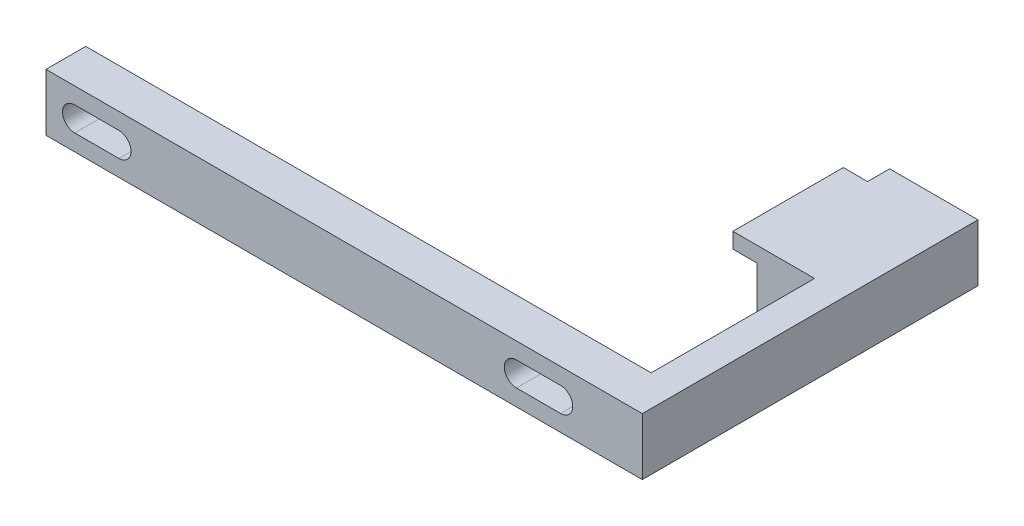
ISO-10303-21;
HEADER;
FILE_DESCRIPTION(('STEP AP214'),'2;1');
FILE_NAME('part.step','',(''),(''),'','','');
FILE_SCHEMA(('AUTOMOTIVE_DESIGN { 1 0 10303 214 1 1 1 1 }'));
ENDSEC;
DATA;
#1=APPLICATION_CONTEXT('core data for automotive mechanical design processes');
#2=APPLICATION_PROTOCOL_DEFINITION('international standard','automotive_design',2000,#1);
#3=PRODUCT_CONTEXT('',#1,'mechanical');
#4=PRODUCT('Part','Part','',(#3));
#5=PRODUCT_RELATED_PRODUCT_CATEGORY('part','',(#4));
#6=PRODUCT_DEFINITION_FORMATION('','',#4);
#7=PRODUCT_DEFINITION_CONTEXT('part definition',#1,'design');
#8=PRODUCT_DEFINITION('design','',#6,#7);
#9=PRODUCT_DEFINITION_SHAPE('','',#8);
#10=(LENGTH_UNIT() NAMED_UNIT(*) SI_UNIT(.MILLI.,.METRE.));
#11=(NAMED_UNIT(*) PLANE_ANGLE_UNIT() SI_UNIT($,.RADIAN.));
#12=(NAMED_UNIT(*) SI_UNIT($,.STERADIAN.) SOLID_ANGLE_UNIT());
#13=UNCERTAINTY_MEASURE_WITH_UNIT(LENGTH_MEASURE(1.E-05),#10,'distance_accuracy_value','');
#14=(GEOMETRIC_REPRESENTATION_CONTEXT(3) GLOBAL_UNCERTAINTY_ASSIGNED_CONTEXT((#13)) GLOBAL_UNIT_ASSIGNED_CONTEXT((#10,
#11,#12)) REPRESENTATION_CONTEXT('',''));
#15=CARTESIAN_POINT('',(0.,0.,0.));
#16=DIRECTION('',(0.,0.,1.));
#17=DIRECTION('',(1.,0.,0.));
#18=AXIS2_PLACEMENT_3D('',#15,#16,#17);
#19=CARTESIAN_POINT('',(107.5,0.,0.));
#20=DIRECTION('',(1.,0.,0.));
#21=DIRECTION('',(0.,0.,-1.));
#22=AXIS2_PLACEMENT_3D('',#19,#20,#21);
#23=PLANE('',#22);
#24=CARTESIAN_POINT('',(107.5,-3.71881314497985,-58.8));
#25=DIRECTION('',(-1.,0.,0.));
#26=DIRECTION('',(0.,0.,1.));
#27=AXIS2_PLACEMENT_3D('',#24,#25,#26);
#28=CIRCLE('',#27,1.5);
#29=CARTESIAN_POINT('',(107.5,-3.71881314497985,-57.3));
#30=VERTEX_POINT('',#29);
#31=EDGE_CURVE('E280',#30,#30,#28,.T.);
#32=ORIENTED_EDGE('',*,*,#31,.F.);
#33=EDGE_LOOP('',(#32));
#34=FACE_BOUND('',#33,.T.);
#35=CARTESIAN_POINT('',(107.5,-3.71881314497985,-39.75));
#36=DIRECTION('',(-1.,0.,0.));
#37=DIRECTION('',(0.,0.,1.));
#38=AXIS2_PLACEMENT_3D('',#35,#36,#37);
#39=CIRCLE('',#38,1.5);
#40=CARTESIAN_POINT('',(107.5,-3.71881314497985,-38.25));
#41=VERTEX_POINT('',#40);
#42=EDGE_CURVE('E277',#41,#41,#39,.T.);
#43=ORIENTED_EDGE('',*,*,#42,.F.);
#44=EDGE_LOOP('',(#43));
#45=FACE_BOUND('',#44,.T.);
#46=DIRECTION('',(0.,-1.,0.));
#47=VECTOR('',#46,1.);
#48=CARTESIAN_POINT('',(107.5,6.46881314497985,-62.));
#49=LINE('',#48,#47);
#50=CARTESIAN_POINT('',(107.5,6.46881314497985,-62.));
#51=VERTEX_POINT('',#50);
#52=CARTESIAN_POINT('',(107.5,2.96881314497985,-62.));
#53=VERTEX_POINT('',#52);
#54=EDGE_CURVE('E217',#51,#53,#49,.T.);
#55=ORIENTED_EDGE('',*,*,#54,.F.);
#56=DIRECTION('',(0.,0.,1.));
#57=VECTOR('',#56,1.);
#58=CARTESIAN_POINT('',(107.5,6.46881314497985,-54.));
#59=LINE('',#58,#57);
#60=CARTESIAN_POINT('',(107.5,6.46881314497985,-67.));
#61=VERTEX_POINT('',#60);
#62=EDGE_CURVE('E305',#61,#51,#59,.T.);
#63=ORIENTED_EDGE('',*,*,#62,.F.);
#64=DIRECTION('',(0.,-1.,0.));
#65=VECTOR('',#64,1.);
#66=CARTESIAN_POINT('',(107.5,-6.46881314497985,-67.));
#67=LINE('',#66,#65);
#68=CARTESIAN_POINT('',(107.5,-6.46881314497985,-67.));
#69=VERTEX_POINT('',#68);
#70=EDGE_CURVE('E276',#61,#69,#67,.T.);
#71=ORIENTED_EDGE('',*,*,#70,.T.);
#72=DIRECTION('',(0.,0.,-1.));
#73=VECTOR('',#72,1.);
#74=CARTESIAN_POINT('',(107.5,-6.46881314497985,-54.));
#75=LINE('',#74,#73);
#76=CARTESIAN_POINT('',(107.5,-6.46881314497985,-37.));
#77=VERTEX_POINT('',#76);
#78=EDGE_CURVE('E306',#77,#69,#75,.T.);
#79=ORIENTED_EDGE('',*,*,#78,.F.);
#80=DIRECTION('',(0.,1.,0.));
#81=VECTOR('',#80,1.);
#82=CARTESIAN_POINT('',(107.5,6.46881314497985,-37.));
#83=LINE('',#82,#81);
#84=CARTESIAN_POINT('',(107.5,2.96881314497985,-37.));
#85=VERTEX_POINT('',#84);
#86=EDGE_CURVE('E287',#77,#85,#83,.T.);
#87=ORIENTED_EDGE('',*,*,#86,.T.);
#88=DIRECTION('',(0.,0.,1.));
#89=VECTOR('',#88,1.);
#90=CARTESIAN_POINT('',(107.5,2.96881314497985,-62.));
#91=LINE('',#90,#89);
#92=EDGE_CURVE('E252',#53,#85,#91,.T.);
#93=ORIENTED_EDGE('',*,*,#92,.F.);
#94=EDGE_LOOP('',(#55,#63,#71,#79,#87,#93));
#95=FACE_BOUND('',#94,.T.);
#96=ADVANCED_FACE('F46',(#34,#45,#95),#23,.F.);
#97=CARTESIAN_POINT('',(120.5,6.46881314497985,-131.709934534819));
#98=DIRECTION('',(1.,0.,0.));
#99=DIRECTION('',(0.,0.,-1.));
#100=AXIS2_PLACEMENT_3D('',#97,#98,#99);
#101=PLANE('',#100);
#102=DIRECTION('',(0.,0.,1.));
#103=VECTOR('',#102,1.);
#104=CARTESIAN_POINT('',(120.5,6.46881314497985,-131.709934534819));
#105=LINE('',#104,#103);
#106=CARTESIAN_POINT('',(120.5,6.46881314497985,-37.));
#107=VERTEX_POINT('',#106);
#108=CARTESIAN_POINT('',(120.5,6.46881314497985,0.));
#109=VERTEX_POINT('',#108);
#110=EDGE_CURVE('E314',#107,#109,#105,.T.);
#111=ORIENTED_EDGE('',*,*,#110,.F.);
#112=DIRECTION('',(0.,-1.,0.));
#113=VECTOR('',#112,1.);
#114=CARTESIAN_POINT('',(120.5,6.46881314497985,-37.));
#115=LINE('',#114,#113);
#116=CARTESIAN_POINT('',(120.5,-6.46881314497985,-37.));
#117=VERTEX_POINT('',#116);
#118=EDGE_CURVE('E303',#107,#117,#115,.T.);
#119=ORIENTED_EDGE('',*,*,#118,.T.);
#120=DIRECTION('',(0.,0.,1.));
#121=VECTOR('',#120,1.);
#122=CARTESIAN_POINT('',(120.5,-6.46881314497985,-131.709934534819));
#123=LINE('',#122,#121);
#124=CARTESIAN_POINT('',(120.5,-6.46881314497985,0.));
#125=VERTEX_POINT('',#124);
#126=EDGE_CURVE('E308',#117,#125,#123,.T.);
#127=ORIENTED_EDGE('',*,*,#126,.T.);
#128=DIRECTION('',(0.,1.,0.));
#129=VECTOR('',#128,1.);
#130=CARTESIAN_POINT('',(120.5,6.46881314497985,0.));
#131=LINE('',#130,#129);
#132=EDGE_CURVE('E311',#125,#109,#131,.T.);
#133=ORIENTED_EDGE('',*,*,#132,.T.);
#134=EDGE_LOOP('',(#111,#119,#127,#133));
#135=FACE_BOUND('',#134,.T.);
#136=ADVANCED_FACE('F368',(#135),#101,.F.);
#137=CARTESIAN_POINT('',(-7.5,-6.46881314497985,9.));
#138=DIRECTION('',(1.,0.,0.));
#139=DIRECTION('',(0.,0.,-1.));
#140=AXIS2_PLACEMENT_3D('',#137,#138,#139);
#141=PLANE('',#140);
#142=DIRECTION('',(0.,-1.,0.));
#143=VECTOR('',#142,1.);
#144=CARTESIAN_POINT('',(-7.5,-6.46881314497985,0.));
#145=LINE('',#144,#143);
#146=CARTESIAN_POINT('',(-7.5,6.46881314497985,0.));
#147=VERTEX_POINT('',#146);
#148=CARTESIAN_POINT('',(-7.5,-6.46881314497985,0.));
#149=VERTEX_POINT('',#148);
#150=EDGE_CURVE('E317',#147,#149,#145,.T.);
#151=ORIENTED_EDGE('',*,*,#150,.T.);
#152=DIRECTION('',(0.,0.,-1.));
#153=VECTOR('',#152,1.);
#154=CARTESIAN_POINT('',(-7.5,-6.46881314497985,9.));
#155=LINE('',#154,#153);
#156=CARTESIAN_POINT('',(-7.5,-6.46881314497985,9.));
#157=VERTEX_POINT('',#156);
#158=EDGE_CURVE('E13',#157,#149,#155,.T.);
#159=ORIENTED_EDGE('',*,*,#158,.F.);
#160=DIRECTION('',(0.,-1.,0.));
#161=VECTOR('',#160,1.);
#162=CARTESIAN_POINT('',(-7.5,-6.46881314497985,9.));
#163=LINE('',#162,#161);
#164=CARTESIAN_POINT('',(-7.5,6.46881314497985,9.));
#165=VERTEX_POINT('',#164);
#166=EDGE_CURVE('E318',#165,#157,#163,.T.);
#167=ORIENTED_EDGE('',*,*,#166,.F.);
#168=DIRECTION('',(0.,0.,-1.));
#169=VECTOR('',#168,1.);
#170=CARTESIAN_POINT('',(-7.5,6.46881314497985,9.));
#171=LINE('',#170,#169);
#172=EDGE_CURVE('E328',#165,#147,#171,.T.);
#173=ORIENTED_EDGE('',*,*,#172,.T.);
#174=EDGE_LOOP('',(#151,#159,#167,#173));
#175=FACE_BOUND('',#174,.T.);
#176=ADVANCED_FACE('F48',(#175),#141,.F.);
#177=CARTESIAN_POINT('',(-7.5,-6.46881314497985,9.));
#178=DIRECTION('',(0.,1.,0.));
#179=DIRECTION('',(0.,0.,1.));
#180=AXIS2_PLACEMENT_3D('',#177,#178,#179);
#181=PLANE('',#180);
#182=ORIENTED_EDGE('',*,*,#126,.F.);
#183=DIRECTION('',(-1.,0.,0.));
#184=VECTOR('',#183,1.);
#185=CARTESIAN_POINT('',(160.170815325282,-6.46881314497985,-37.));
#186=LINE('',#185,#184);
#187=EDGE_CURVE('E293',#117,#77,#186,.T.);
#188=ORIENTED_EDGE('',*,*,#187,.T.);
#189=ORIENTED_EDGE('',*,*,#78,.T.);
#190=DIRECTION('',(-1.,0.,0.));
#191=VECTOR('',#190,1.);
#192=CARTESIAN_POINT('',(160.170815325282,-6.46881314497985,-67.));
#193=LINE('',#192,#191);
#194=CARTESIAN_POINT('',(127.5,-6.46881314497985,-67.));
#195=VERTEX_POINT('',#194);
#196=EDGE_CURVE('E296',#195,#69,#193,.T.);
#197=ORIENTED_EDGE('',*,*,#196,.F.);
#198=DIRECTION('',(0.,0.,-1.));
#199=VECTOR('',#198,1.);
#200=CARTESIAN_POINT('',(127.5,-6.46881314497985,9.));
#201=LINE('',#200,#199);
#202=CARTESIAN_POINT('',(127.5,-6.46881314497985,9.));
#203=VERTEX_POINT('',#202);
#204=EDGE_CURVE('E54',#203,#195,#201,.T.);
#205=ORIENTED_EDGE('',*,*,#204,.F.);
#206=DIRECTION('',(1.,0.,0.));
#207=VECTOR('',#206,1.);
#208=CARTESIAN_POINT('',(-7.5,-6.46881314497985,9.));
#209=LINE('',#208,#207);
#210=EDGE_CURVE('E321',#157,#203,#209,.T.);
#211=ORIENTED_EDGE('',*,*,#210,.F.);
#212=ORIENTED_EDGE('',*,*,#158,.T.);
#213=DIRECTION('',(1.,0.,0.));
#214=VECTOR('',#213,1.);
#215=CARTESIAN_POINT('',(-7.5,-6.46881314497985,0.));
#216=LINE('',#215,#214);
#217=EDGE_CURVE('E331',#149,#125,#216,.T.);
#218=ORIENTED_EDGE('',*,*,#217,.T.);
#219=EDGE_LOOP('',(#182,#188,#189,#197,#205,#211,#212,#218));
#220=FACE_BOUND('',#219,.T.);
#221=ADVANCED_FACE('F348',(#220),#181,.F.);
#222=CARTESIAN_POINT('',(127.5,-6.46881314497985,9.));
#223=DIRECTION('',(-1.,0.,0.));
#224=DIRECTION('',(0.,0.,1.));
#225=AXIS2_PLACEMENT_3D('',#222,#223,#224);
#226=PLANE('',#225);
#227=ORIENTED_EDGE('',*,*,#204,.T.);
#228=DIRECTION('',(0.,1.,0.));
#229=VECTOR('',#228,1.);
#230=CARTESIAN_POINT('',(127.5,-6.46881314497985,-67.));
#231=LINE('',#230,#229);
#232=CARTESIAN_POINT('',(127.5,6.46881314497985,-67.));
#233=VERTEX_POINT('',#232);
#234=EDGE_CURVE('E292',#195,#233,#231,.T.);
#235=ORIENTED_EDGE('',*,*,#234,.T.);
#236=DIRECTION('',(0.,0.,-1.));
#237=VECTOR('',#236,1.);
#238=CARTESIAN_POINT('',(127.5,6.46881314497985,9.));
#239=LINE('',#238,#237);
#240=CARTESIAN_POINT('',(127.5,6.46881314497985,9.));
#241=VERTEX_POINT('',#240);
#242=EDGE_CURVE('E337',#241,#233,#239,.T.);
#243=ORIENTED_EDGE('',*,*,#242,.F.);
#244=DIRECTION('',(0.,1.,0.));
#245=VECTOR('',#244,1.);
#246=CARTESIAN_POINT('',(127.5,-6.46881314497985,9.));
#247=LINE('',#246,#245);
#248=EDGE_CURVE('E324',#203,#241,#247,.T.);
#249=ORIENTED_EDGE('',*,*,#248,.F.);
#250=EDGE_LOOP('',(#227,#235,#243,#249));
#251=FACE_BOUND('',#250,.T.);
#252=ADVANCED_FACE('F342',(#251),#226,.F.);
#253=CARTESIAN_POINT('',(-7.5,6.46881314497985,9.));
#254=DIRECTION('',(0.,-1.,0.));
#255=DIRECTION('',(0.,0.,-1.));
#256=AXIS2_PLACEMENT_3D('',#253,#254,#255);
#257=PLANE('',#256);
#258=DIRECTION('',(-1.,0.,0.));
#259=VECTOR('',#258,1.);
#260=CARTESIAN_POINT('',(160.170815325282,6.46881314497985,-37.));
#261=LINE('',#260,#259);
#262=CARTESIAN_POINT('',(102.,6.46881314497985,-37.));
#263=VERTEX_POINT('',#262);
#264=EDGE_CURVE('E290',#107,#263,#261,.T.);
#265=ORIENTED_EDGE('',*,*,#264,.F.);
#266=ORIENTED_EDGE('',*,*,#110,.T.);
#267=DIRECTION('',(-1.,0.,0.));
#268=VECTOR('',#267,1.);
#269=CARTESIAN_POINT('',(-7.5,6.46881314497985,0.));
#270=LINE('',#269,#268);
#271=EDGE_CURVE('E322',#109,#147,#270,.T.);
#272=ORIENTED_EDGE('',*,*,#271,.T.);
#273=ORIENTED_EDGE('',*,*,#172,.F.);
#274=DIRECTION('',(-1.,0.,0.));
#275=VECTOR('',#274,1.);
#276=CARTESIAN_POINT('',(-7.5,6.46881314497985,9.));
#277=LINE('',#276,#275);
#278=EDGE_CURVE('E326',#241,#165,#277,.T.);
#279=ORIENTED_EDGE('',*,*,#278,.F.);
#280=ORIENTED_EDGE('',*,*,#242,.T.);
#281=DIRECTION('',(-1.,0.,0.));
#282=VECTOR('',#281,1.);
#283=CARTESIAN_POINT('',(160.170815325282,6.46881314497985,-67.));
#284=LINE('',#283,#282);
#285=EDGE_CURVE('E289',#233,#61,#284,.T.);
#286=ORIENTED_EDGE('',*,*,#285,.T.);
#287=ORIENTED_EDGE('',*,*,#62,.T.);
#288=DIRECTION('',(1.,0.,0.));
#289=VECTOR('',#288,1.);
#290=CARTESIAN_POINT('',(102.,6.46881314497985,-62.));
#291=LINE('',#290,#289);
#292=CARTESIAN_POINT('',(102.,6.46881314497985,-62.));
#293=VERTEX_POINT('',#292);
#294=EDGE_CURVE('E259',#293,#51,#291,.T.);
#295=ORIENTED_EDGE('',*,*,#294,.F.);
#296=DIRECTION('',(0.,0.,-1.));
#297=VECTOR('',#296,1.);
#298=CARTESIAN_POINT('',(102.,6.46881314497985,-62.));
#299=LINE('',#298,#297);
#300=EDGE_CURVE('E257',#263,#293,#299,.T.);
#301=ORIENTED_EDGE('',*,*,#300,.F.);
#302=EDGE_LOOP('',(#265,#266,#272,#273,#279,#280,#286,#287,#295,#301));
#303=FACE_BOUND('',#302,.T.);
#304=ADVANCED_FACE('F354',(#303),#257,.F.);
#305=CARTESIAN_POINT('',(0.,0.,9.));
#306=DIRECTION('',(0.,0.,-1.));
#307=DIRECTION('',(-1.,0.,0.));
#308=AXIS2_PLACEMENT_3D('',#305,#306,#307);
#309=PLANE('',#308);
#310=CARTESIAN_POINT('',(9.,0.,9.));
#311=DIRECTION('',(0.,0.,1.));
#312=DIRECTION('',(1.,0.,0.));
#313=AXIS2_PLACEMENT_3D('',#310,#311,#312);
#314=CIRCLE('',#313,2.75);
#315=CARTESIAN_POINT('',(9.,-2.75,9.));
#316=VERTEX_POINT('',#315);
#317=CARTESIAN_POINT('',(9.,2.75,9.));
#318=VERTEX_POINT('',#317);
#319=EDGE_CURVE('E203',#316,#318,#314,.T.);
#320=ORIENTED_EDGE('',*,*,#319,.F.);
#321=DIRECTION('',(1.,0.,0.));
#322=VECTOR('',#321,1.);
#323=CARTESIAN_POINT('',(-1.,-2.75,9.));
#324=LINE('',#323,#322);
#325=CARTESIAN_POINT('',(-1.,-2.75,9.));
#326=VERTEX_POINT('',#325);
#327=EDGE_CURVE('E196',#326,#316,#324,.T.);
#328=ORIENTED_EDGE('',*,*,#327,.F.);
#329=CARTESIAN_POINT('',(-1.,0.,9.));
#330=DIRECTION('',(0.,0.,1.));
#331=DIRECTION('',(1.,0.,0.));
#332=AXIS2_PLACEMENT_3D('',#329,#330,#331);
#333=CIRCLE('',#332,2.75);
#334=CARTESIAN_POINT('',(-1.,2.75,9.));
#335=VERTEX_POINT('',#334);
#336=EDGE_CURVE('E207',#335,#326,#333,.T.);
#337=ORIENTED_EDGE('',*,*,#336,.F.);
#338=DIRECTION('',(-1.,0.,0.));
#339=VECTOR('',#338,1.);
#340=CARTESIAN_POINT('',(-1.,2.75,9.));
#341=LINE('',#340,#339);
#342=EDGE_CURVE('E61',#318,#335,#341,.T.);
#343=ORIENTED_EDGE('',*,*,#342,.F.);
#344=EDGE_LOOP('',(#320,#328,#337,#343));
#345=FACE_BOUND('',#344,.T.);
#346=CARTESIAN_POINT('',(99.,0.,9.));
#347=DIRECTION('',(0.,0.,1.));
#348=DIRECTION('',(1.,0.,0.));
#349=AXIS2_PLACEMENT_3D('',#346,#347,#348);
#350=CIRCLE('',#349,2.75);
#351=CARTESIAN_POINT('',(99.,2.75000000000001,9.));
#352=VERTEX_POINT('',#351);
#353=CARTESIAN_POINT('',(99.,-2.75,9.));
#354=VERTEX_POINT('',#353);
#355=EDGE_CURVE('E244',#352,#354,#350,.T.);
#356=ORIENTED_EDGE('',*,*,#355,.F.);
#357=DIRECTION('',(-1.,0.,0.));
#358=VECTOR('',#357,1.);
#359=CARTESIAN_POINT('',(109.,2.75,9.));
#360=LINE('',#359,#358);
#361=CARTESIAN_POINT('',(109.,2.75,9.));
#362=VERTEX_POINT('',#361);
#363=EDGE_CURVE('E241',#362,#352,#360,.T.);
#364=ORIENTED_EDGE('',*,*,#363,.F.);
#365=CARTESIAN_POINT('',(109.,0.,9.));
#366=DIRECTION('',(0.,0.,1.));
#367=DIRECTION('',(1.,0.,0.));
#368=AXIS2_PLACEMENT_3D('',#365,#366,#367);
#369=CIRCLE('',#368,2.75);
#370=CARTESIAN_POINT('',(109.,-2.74999999999999,9.));
#371=VERTEX_POINT('',#370);
#372=EDGE_CURVE('E238',#371,#362,#369,.T.);
#373=ORIENTED_EDGE('',*,*,#372,.F.);
#374=DIRECTION('',(1.,0.,0.));
#375=VECTOR('',#374,1.);
#376=CARTESIAN_POINT('',(109.,-2.75,9.));
#377=LINE('',#376,#375);
#378=EDGE_CURVE('E69',#354,#371,#377,.T.);
#379=ORIENTED_EDGE('',*,*,#378,.F.);
#380=EDGE_LOOP('',(#356,#364,#373,#379));
#381=FACE_BOUND('',#380,.T.);
#382=ORIENTED_EDGE('',*,*,#166,.T.);
#383=ORIENTED_EDGE('',*,*,#210,.T.);
#384=ORIENTED_EDGE('',*,*,#248,.T.);
#385=ORIENTED_EDGE('',*,*,#278,.T.);
#386=EDGE_LOOP('',(#382,#383,#384,#385));
#387=FACE_BOUND('',#386,.T.);
#388=ADVANCED_FACE('F360',(#345,#381,#387),#309,.F.);
#389=CARTESIAN_POINT('',(0.,0.,0.));
#390=DIRECTION('',(0.,0.,-1.));
#391=DIRECTION('',(-1.,0.,0.));
#392=AXIS2_PLACEMENT_3D('',#389,#390,#391);
#393=PLANE('',#392);
#394=DIRECTION('',(1.,0.,0.));
#395=VECTOR('',#394,1.);
#396=CARTESIAN_POINT('',(-1.,-2.75,0.));
#397=LINE('',#396,#395);
#398=CARTESIAN_POINT('',(-1.,-2.75,0.));
#399=VERTEX_POINT('',#398);
#400=CARTESIAN_POINT('',(9.,-2.75,0.));
#401=VERTEX_POINT('',#400);
#402=EDGE_CURVE('E193',#399,#401,#397,.T.);
#403=ORIENTED_EDGE('',*,*,#402,.T.);
#404=CARTESIAN_POINT('',(9.,0.,0.));
#405=DIRECTION('',(0.,0.,-1.));
#406=DIRECTION('',(-1.,0.,0.));
#407=AXIS2_PLACEMENT_3D('',#404,#405,#406);
#408=CIRCLE('',#407,2.75);
#409=CARTESIAN_POINT('',(9.,2.75,0.));
#410=VERTEX_POINT('',#409);
#411=EDGE_CURVE('E179',#401,#410,#408,.F.);
#412=ORIENTED_EDGE('',*,*,#411,.T.);
#413=DIRECTION('',(-1.,0.,0.));
#414=VECTOR('',#413,1.);
#415=CARTESIAN_POINT('',(-1.,2.75,0.));
#416=LINE('',#415,#414);
#417=CARTESIAN_POINT('',(-1.,2.75,0.));
#418=VERTEX_POINT('',#417);
#419=EDGE_CURVE('E212',#410,#418,#416,.T.);
#420=ORIENTED_EDGE('',*,*,#419,.T.);
#421=CARTESIAN_POINT('',(-1.,0.,0.));
#422=DIRECTION('',(0.,0.,-1.));
#423=DIRECTION('',(-1.,0.,0.));
#424=AXIS2_PLACEMENT_3D('',#421,#422,#423);
#425=CIRCLE('',#424,2.75);
#426=EDGE_CURVE('E201',#418,#399,#425,.F.);
#427=ORIENTED_EDGE('',*,*,#426,.T.);
#428=EDGE_LOOP('',(#403,#412,#420,#427));
#429=FACE_BOUND('',#428,.T.);
#430=DIRECTION('',(-1.,0.,0.));
#431=VECTOR('',#430,1.);
#432=CARTESIAN_POINT('',(109.,2.75,0.));
#433=LINE('',#432,#431);
#434=CARTESIAN_POINT('',(109.,2.75000000000001,0.));
#435=VERTEX_POINT('',#434);
#436=CARTESIAN_POINT('',(99.,2.75000000000001,0.));
#437=VERTEX_POINT('',#436);
#438=EDGE_CURVE('E223',#435,#437,#433,.T.);
#439=ORIENTED_EDGE('',*,*,#438,.T.);
#440=CARTESIAN_POINT('',(99.,0.,0.));
#441=DIRECTION('',(0.,0.,-1.));
#442=DIRECTION('',(-1.,0.,0.));
#443=AXIS2_PLACEMENT_3D('',#440,#441,#442);
#444=CIRCLE('',#443,2.75);
#445=CARTESIAN_POINT('',(99.,-2.74999999999999,0.));
#446=VERTEX_POINT('',#445);
#447=EDGE_CURVE('E224',#437,#446,#444,.F.);
#448=ORIENTED_EDGE('',*,*,#447,.T.);
#449=DIRECTION('',(1.,0.,0.));
#450=VECTOR('',#449,1.);
#451=CARTESIAN_POINT('',(109.,-2.75,0.));
#452=LINE('',#451,#450);
#453=CARTESIAN_POINT('',(109.,-2.75,0.));
#454=VERTEX_POINT('',#453);
#455=EDGE_CURVE('E227',#446,#454,#452,.T.);
#456=ORIENTED_EDGE('',*,*,#455,.T.);
#457=CARTESIAN_POINT('',(109.,0.,0.));
#458=DIRECTION('',(0.,0.,-1.));
#459=DIRECTION('',(-1.,0.,0.));
#460=AXIS2_PLACEMENT_3D('',#457,#458,#459);
#461=CIRCLE('',#460,2.75);
#462=EDGE_CURVE('E220',#454,#435,#461,.F.);
#463=ORIENTED_EDGE('',*,*,#462,.T.);
#464=EDGE_LOOP('',(#439,#448,#456,#463));
#465=FACE_BOUND('',#464,.T.);
#466=ORIENTED_EDGE('',*,*,#132,.F.);
#467=ORIENTED_EDGE('',*,*,#217,.F.);
#468=ORIENTED_EDGE('',*,*,#150,.F.);
#469=ORIENTED_EDGE('',*,*,#271,.F.);
#470=EDGE_LOOP('',(#466,#467,#468,#469));
#471=FACE_BOUND('',#470,.T.);
#472=ADVANCED_FACE('F199',(#429,#465,#471),#393,.T.);
#473=CARTESIAN_POINT('',(160.170815325282,6.46881314497985,-37.));
#474=DIRECTION('',(0.,0.,1.));
#475=DIRECTION('',(1.,0.,0.));
#476=AXIS2_PLACEMENT_3D('',#473,#474,#475);
#477=PLANE('',#476);
#478=ORIENTED_EDGE('',*,*,#118,.F.);
#479=ORIENTED_EDGE('',*,*,#264,.T.);
#480=DIRECTION('',(0.,1.,0.));
#481=VECTOR('',#480,1.);
#482=CARTESIAN_POINT('',(102.,6.46881314497985,-37.));
#483=LINE('',#482,#481);
#484=CARTESIAN_POINT('',(102.,2.96881314497985,-37.));
#485=VERTEX_POINT('',#484);
#486=EDGE_CURVE('E254',#485,#263,#483,.T.);
#487=ORIENTED_EDGE('',*,*,#486,.F.);
#488=DIRECTION('',(1.,0.,0.));
#489=VECTOR('',#488,1.);
#490=CARTESIAN_POINT('',(102.,2.96881314497985,-37.));
#491=LINE('',#490,#489);
#492=EDGE_CURVE('E266',#485,#85,#491,.T.);
#493=ORIENTED_EDGE('',*,*,#492,.T.);
#494=ORIENTED_EDGE('',*,*,#86,.F.);
#495=ORIENTED_EDGE('',*,*,#187,.F.);
#496=EDGE_LOOP('',(#478,#479,#487,#493,#494,#495));
#497=FACE_BOUND('',#496,.T.);
#498=ADVANCED_FACE('F373',(#497),#477,.T.);
#499=CARTESIAN_POINT('',(160.170815325282,-6.46881314497985,-67.));
#500=DIRECTION('',(0.,0.,-1.));
#501=DIRECTION('',(-1.,0.,0.));
#502=AXIS2_PLACEMENT_3D('',#499,#500,#501);
#503=PLANE('',#502);
#504=ORIENTED_EDGE('',*,*,#234,.F.);
#505=ORIENTED_EDGE('',*,*,#196,.T.);
#506=ORIENTED_EDGE('',*,*,#70,.F.);
#507=ORIENTED_EDGE('',*,*,#285,.F.);
#508=EDGE_LOOP('',(#504,#505,#506,#507));
#509=FACE_BOUND('',#508,.T.);
#510=ADVANCED_FACE('F351',(#509),#503,.T.);
#511=CARTESIAN_POINT('',(112.5,-3.71881314497985,-58.8));
#512=DIRECTION('',(-1.,0.,0.));
#513=DIRECTION('',(0.,0.,1.));
#514=AXIS2_PLACEMENT_3D('',#511,#512,#513);
#515=CYLINDRICAL_SURFACE('',#514,1.5);
#516=CARTESIAN_POINT('',(112.5,-3.71881314497985,-58.8));
#517=DIRECTION('',(-1.,0.,0.));
#518=DIRECTION('',(0.,0.,1.));
#519=AXIS2_PLACEMENT_3D('',#516,#517,#518);
#520=CIRCLE('',#519,1.5);
#521=CARTESIAN_POINT('',(112.5,-3.71881314497985,-57.3));
#522=VERTEX_POINT('',#521);
#523=EDGE_CURVE('E272',#522,#522,#520,.T.);
#524=ORIENTED_EDGE('',*,*,#523,.F.);
#525=EDGE_LOOP('',(#524));
#526=FACE_BOUND('',#525,.T.);
#527=ORIENTED_EDGE('',*,*,#31,.T.);
#528=EDGE_LOOP('',(#527));
#529=FACE_BOUND('',#528,.T.);
#530=ADVANCED_FACE('F454',(#526,#529),#515,.F.);
#531=CARTESIAN_POINT('',(112.5,-3.71881314497985,-58.8));
#532=DIRECTION('',(-1.,0.,0.));
#533=DIRECTION('',(0.,0.,1.));
#534=AXIS2_PLACEMENT_3D('',#531,#532,#533);
#535=PLANE('',#534);
#536=ORIENTED_EDGE('',*,*,#523,.T.);
#537=EDGE_LOOP('',(#536));
#538=FACE_BOUND('',#537,.T.);
#539=ADVANCED_FACE('F461',(#538),#535,.T.);
#540=CARTESIAN_POINT('',(112.5,-3.71881314497985,-39.75));
#541=DIRECTION('',(-1.,0.,0.));
#542=DIRECTION('',(0.,0.,1.));
#543=AXIS2_PLACEMENT_3D('',#540,#541,#542);
#544=CYLINDRICAL_SURFACE('',#543,1.5);
#545=CARTESIAN_POINT('',(112.5,-3.71881314497985,-39.75));
#546=DIRECTION('',(-1.,0.,0.));
#547=DIRECTION('',(0.,0.,1.));
#548=AXIS2_PLACEMENT_3D('',#545,#546,#547);
#549=CIRCLE('',#548,1.5);
#550=CARTESIAN_POINT('',(112.5,-3.71881314497985,-38.25));
#551=VERTEX_POINT('',#550);
#552=EDGE_CURVE('E273',#551,#551,#549,.T.);
#553=ORIENTED_EDGE('',*,*,#552,.F.);
#554=EDGE_LOOP('',(#553));
#555=FACE_BOUND('',#554,.T.);
#556=ORIENTED_EDGE('',*,*,#42,.T.);
#557=EDGE_LOOP('',(#556));
#558=FACE_BOUND('',#557,.T.);
#559=ADVANCED_FACE('F470',(#555,#558),#544,.F.);
#560=CARTESIAN_POINT('',(112.5,-3.71881314497985,-39.75));
#561=DIRECTION('',(-1.,0.,0.));
#562=DIRECTION('',(0.,0.,1.));
#563=AXIS2_PLACEMENT_3D('',#560,#561,#562);
#564=PLANE('',#563);
#565=ORIENTED_EDGE('',*,*,#552,.T.);
#566=EDGE_LOOP('',(#565));
#567=FACE_BOUND('',#566,.T.);
#568=ADVANCED_FACE('F479',(#567),#564,.T.);
#569=CARTESIAN_POINT('',(102.,6.46881314497985,-62.));
#570=DIRECTION('',(0.,0.,1.));
#571=DIRECTION('',(0.,-1.,0.));
#572=AXIS2_PLACEMENT_3D('',#569,#570,#571);
#573=PLANE('',#572);
#574=ORIENTED_EDGE('',*,*,#54,.T.);
#575=DIRECTION('',(1.,0.,0.));
#576=VECTOR('',#575,1.);
#577=CARTESIAN_POINT('',(102.,2.96881314497985,-62.));
#578=LINE('',#577,#576);
#579=CARTESIAN_POINT('',(102.,2.96881314497985,-62.));
#580=VERTEX_POINT('',#579);
#581=EDGE_CURVE('E269',#580,#53,#578,.T.);
#582=ORIENTED_EDGE('',*,*,#581,.F.);
#583=DIRECTION('',(0.,-1.,0.));
#584=VECTOR('',#583,1.);
#585=CARTESIAN_POINT('',(102.,6.46881314497985,-62.));
#586=LINE('',#585,#584);
#587=EDGE_CURVE('E248',#293,#580,#586,.T.);
#588=ORIENTED_EDGE('',*,*,#587,.F.);
#589=ORIENTED_EDGE('',*,*,#294,.T.);
#590=EDGE_LOOP('',(#574,#582,#588,#589));
#591=FACE_BOUND('',#590,.T.);
#592=ADVANCED_FACE('F382',(#591),#573,.F.);
#593=CARTESIAN_POINT('',(102.,2.96881314497985,-62.));
#594=DIRECTION('',(0.,1.,0.));
#595=DIRECTION('',(0.,0.,1.));
#596=AXIS2_PLACEMENT_3D('',#593,#594,#595);
#597=PLANE('',#596);
#598=ORIENTED_EDGE('',*,*,#92,.T.);
#599=ORIENTED_EDGE('',*,*,#492,.F.);
#600=DIRECTION('',(0.,0.,1.));
#601=VECTOR('',#600,1.);
#602=CARTESIAN_POINT('',(102.,2.96881314497985,-62.));
#603=LINE('',#602,#601);
#604=EDGE_CURVE('E251',#580,#485,#603,.T.);
#605=ORIENTED_EDGE('',*,*,#604,.F.);
#606=ORIENTED_EDGE('',*,*,#581,.T.);
#607=EDGE_LOOP('',(#598,#599,#605,#606));
#608=FACE_BOUND('',#607,.T.);
#609=ADVANCED_FACE('F378',(#608),#597,.F.);
#610=CARTESIAN_POINT('',(102.,0.,0.));
#611=DIRECTION('',(-1.,0.,0.));
#612=DIRECTION('',(0.,0.,1.));
#613=AXIS2_PLACEMENT_3D('',#610,#611,#612);
#614=PLANE('',#613);
#615=ORIENTED_EDGE('',*,*,#587,.T.);
#616=ORIENTED_EDGE('',*,*,#604,.T.);
#617=ORIENTED_EDGE('',*,*,#486,.T.);
#618=ORIENTED_EDGE('',*,*,#300,.T.);
#619=EDGE_LOOP('',(#615,#616,#617,#618));
#620=FACE_BOUND('',#619,.T.);
#621=ADVANCED_FACE('F385',(#620),#614,.T.);
#622=CARTESIAN_POINT('',(109.,2.75,-16.4468842033985));
#623=DIRECTION('',(0.,1.,0.));
#624=DIRECTION('',(-1.,0.,0.));
#625=AXIS2_PLACEMENT_3D('',#622,#623,#624);
#626=PLANE('',#625);
#627=DIRECTION('',(0.,0.,1.));
#628=VECTOR('',#627,1.);
#629=CARTESIAN_POINT('',(109.,2.75,-16.4468842033985));
#630=LINE('',#629,#628);
#631=EDGE_CURVE('E218',#435,#362,#630,.T.);
#632=ORIENTED_EDGE('',*,*,#631,.T.);
#633=ORIENTED_EDGE('',*,*,#363,.T.);
#634=DIRECTION('',(0.,0.,1.));
#635=VECTOR('',#634,1.);
#636=CARTESIAN_POINT('',(99.,2.75000000000001,-16.4468842033985));
#637=LINE('',#636,#635);
#638=EDGE_CURVE('E221',#437,#352,#637,.T.);
#639=ORIENTED_EDGE('',*,*,#638,.F.);
#640=ORIENTED_EDGE('',*,*,#438,.F.);
#641=EDGE_LOOP('',(#632,#633,#639,#640));
#642=FACE_BOUND('',#641,.T.);
#643=ADVANCED_FACE('F387',(#642),#626,.F.);
#644=CARTESIAN_POINT('',(99.,0.,-16.4468842033985));
#645=DIRECTION('',(0.,0.,1.));
#646=DIRECTION('',(1.,0.,0.));
#647=AXIS2_PLACEMENT_3D('',#644,#645,#646);
#648=CYLINDRICAL_SURFACE('',#647,2.75);
#649=ORIENTED_EDGE('',*,*,#638,.T.);
#650=ORIENTED_EDGE('',*,*,#355,.T.);
#651=DIRECTION('',(0.,0.,1.));
#652=VECTOR('',#651,1.);
#653=CARTESIAN_POINT('',(99.,-2.75,-16.4468842033985));
#654=LINE('',#653,#652);
#655=EDGE_CURVE('E225',#446,#354,#654,.T.);
#656=ORIENTED_EDGE('',*,*,#655,.F.);
#657=ORIENTED_EDGE('',*,*,#447,.F.);
#658=EDGE_LOOP('',(#649,#650,#656,#657));
#659=FACE_BOUND('',#658,.T.);
#660=ADVANCED_FACE('F394',(#659),#648,.F.);
#661=CARTESIAN_POINT('',(109.,-2.75,-16.4468842033985));
#662=DIRECTION('',(0.,-1.,0.));
#663=DIRECTION('',(1.,0.,0.));
#664=AXIS2_PLACEMENT_3D('',#661,#662,#663);
#665=PLANE('',#664);
#666=ORIENTED_EDGE('',*,*,#655,.T.);
#667=ORIENTED_EDGE('',*,*,#378,.T.);
#668=DIRECTION('',(0.,0.,1.));
#669=VECTOR('',#668,1.);
#670=CARTESIAN_POINT('',(109.,-2.75,-16.4468842033985));
#671=LINE('',#670,#669);
#672=EDGE_CURVE('E228',#454,#371,#671,.T.);
#673=ORIENTED_EDGE('',*,*,#672,.F.);
#674=ORIENTED_EDGE('',*,*,#455,.F.);
#675=EDGE_LOOP('',(#666,#667,#673,#674));
#676=FACE_BOUND('',#675,.T.);
#677=ADVANCED_FACE('F522',(#676),#665,.F.);
#678=CARTESIAN_POINT('',(109.,0.,-16.4468842033985));
#679=DIRECTION('',(0.,0.,1.));
#680=DIRECTION('',(1.,0.,0.));
#681=AXIS2_PLACEMENT_3D('',#678,#679,#680);
#682=CYLINDRICAL_SURFACE('',#681,2.75);
#683=ORIENTED_EDGE('',*,*,#672,.T.);
#684=ORIENTED_EDGE('',*,*,#372,.T.);
#685=ORIENTED_EDGE('',*,*,#631,.F.);
#686=ORIENTED_EDGE('',*,*,#462,.F.);
#687=EDGE_LOOP('',(#683,#684,#685,#686));
#688=FACE_BOUND('',#687,.T.);
#689=ADVANCED_FACE('F531',(#688),#682,.F.);
#690=CARTESIAN_POINT('',(-1.,-2.75,-16.4468842033985));
#691=DIRECTION('',(0.,-1.,0.));
#692=DIRECTION('',(0.,0.,-1.));
#693=AXIS2_PLACEMENT_3D('',#690,#691,#692);
#694=PLANE('',#693);
#695=DIRECTION('',(0.,0.,1.));
#696=VECTOR('',#695,1.);
#697=CARTESIAN_POINT('',(-1.,-2.75,-16.4468842033985));
#698=LINE('',#697,#696);
#699=EDGE_CURVE('E210',#399,#326,#698,.T.);
#700=ORIENTED_EDGE('',*,*,#699,.T.);
#701=ORIENTED_EDGE('',*,*,#327,.T.);
#702=DIRECTION('',(0.,0.,1.));
#703=VECTOR('',#702,1.);
#704=CARTESIAN_POINT('',(9.,-2.75,-16.4468842033985));
#705=LINE('',#704,#703);
#706=EDGE_CURVE('E183',#401,#316,#705,.T.);
#707=ORIENTED_EDGE('',*,*,#706,.F.);
#708=ORIENTED_EDGE('',*,*,#402,.F.);
#709=EDGE_LOOP('',(#700,#701,#707,#708));
#710=FACE_BOUND('',#709,.T.);
#711=ADVANCED_FACE('F192',(#710),#694,.F.);
#712=CARTESIAN_POINT('',(9.,0.,-16.4468842033985));
#713=DIRECTION('',(0.,0.,1.));
#714=DIRECTION('',(1.,0.,0.));
#715=AXIS2_PLACEMENT_3D('',#712,#713,#714);
#716=CYLINDRICAL_SURFACE('',#715,2.75);
#717=ORIENTED_EDGE('',*,*,#706,.T.);
#718=ORIENTED_EDGE('',*,*,#319,.T.);
#719=DIRECTION('',(0.,0.,1.));
#720=VECTOR('',#719,1.);
#721=CARTESIAN_POINT('',(9.,2.75,-16.4468842033985));
#722=LINE('',#721,#720);
#723=EDGE_CURVE('E185',#410,#318,#722,.T.);
#724=ORIENTED_EDGE('',*,*,#723,.F.);
#725=ORIENTED_EDGE('',*,*,#411,.F.);
#726=EDGE_LOOP('',(#717,#718,#724,#725));
#727=FACE_BOUND('',#726,.T.);
#728=ADVANCED_FACE('F181',(#727),#716,.F.);
#729=CARTESIAN_POINT('',(-1.,2.75,-16.4468842033985));
#730=DIRECTION('',(0.,1.,0.));
#731=DIRECTION('',(0.,0.,1.));
#732=AXIS2_PLACEMENT_3D('',#729,#730,#731);
#733=PLANE('',#732);
#734=ORIENTED_EDGE('',*,*,#723,.T.);
#735=ORIENTED_EDGE('',*,*,#342,.T.);
#736=DIRECTION('',(0.,0.,1.));
#737=VECTOR('',#736,1.);
#738=CARTESIAN_POINT('',(-1.,2.75,-16.4468842033985));
#739=LINE('',#738,#737);
#740=EDGE_CURVE('E211',#418,#335,#739,.T.);
#741=ORIENTED_EDGE('',*,*,#740,.F.);
#742=ORIENTED_EDGE('',*,*,#419,.F.);
#743=EDGE_LOOP('',(#734,#735,#741,#742));
#744=FACE_BOUND('',#743,.T.);
#745=ADVANCED_FACE('F553',(#744),#733,.F.);
#746=CARTESIAN_POINT('',(-1.,0.,-16.4468842033985));
#747=DIRECTION('',(0.,0.,1.));
#748=DIRECTION('',(1.,0.,0.));
#749=AXIS2_PLACEMENT_3D('',#746,#747,#748);
#750=CYLINDRICAL_SURFACE('',#749,2.75);
#751=ORIENTED_EDGE('',*,*,#740,.T.);
#752=ORIENTED_EDGE('',*,*,#336,.T.);
#753=ORIENTED_EDGE('',*,*,#699,.F.);
#754=ORIENTED_EDGE('',*,*,#426,.F.);
#755=EDGE_LOOP('',(#751,#752,#753,#754));
#756=FACE_BOUND('',#755,.T.);
#757=ADVANCED_FACE('F561',(#756),#750,.F.);
#758=CLOSED_SHELL('',(#96,#136,#176,#221,#252,#304,#388,#472,#498,#510,#530,#539,#559,#568,#592,
#609,#621,#643,#660,#677,#689,#711,#728,#745,#757));
#759=MANIFOLD_SOLID_BREP('B2',#758);
#760=ADVANCED_BREP_SHAPE_REPRESENTATION('',(#18,#759),#14);
#761=SHAPE_DEFINITION_REPRESENTATION(#9,#760);
ENDSEC;
END-ISO-10303-21;
